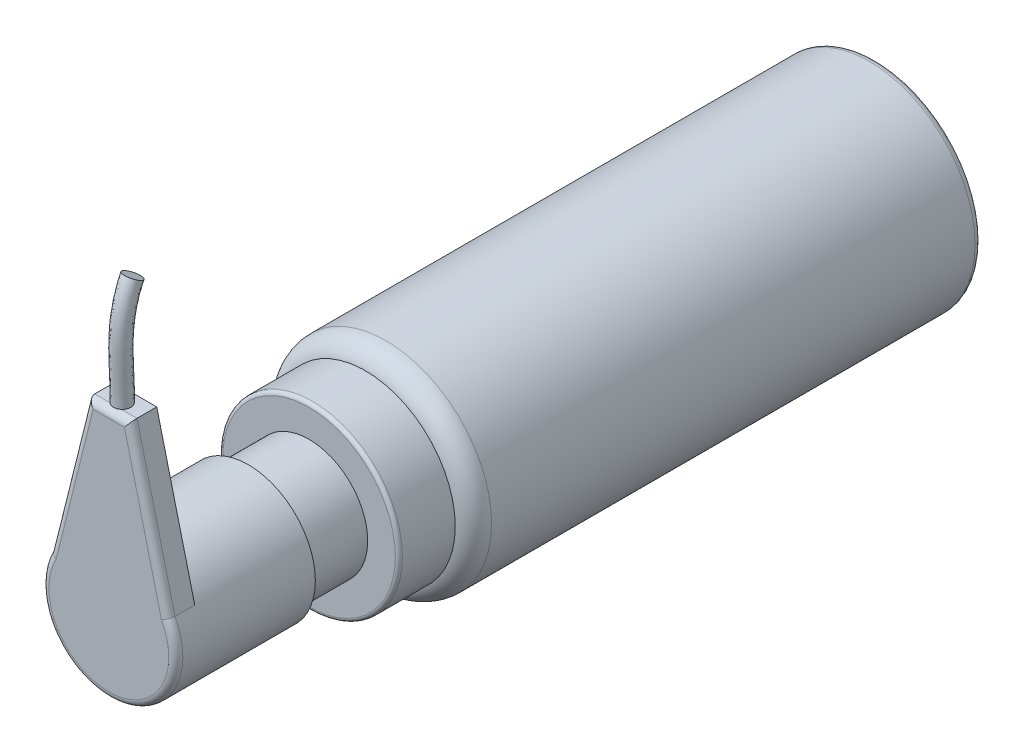
ISO-10303-21;
HEADER;
FILE_DESCRIPTION(('STEP AP214'),'2;1');
FILE_NAME('part.step','',(''),(''),'','','');
FILE_SCHEMA(('AUTOMOTIVE_DESIGN { 1 0 10303 214 1 1 1 1 }'));
ENDSEC;
DATA;
#1=APPLICATION_CONTEXT('core data for automotive mechanical design processes');
#2=APPLICATION_PROTOCOL_DEFINITION('international standard','automotive_design',2000,#1);
#3=PRODUCT_CONTEXT('',#1,'mechanical');
#4=PRODUCT('Part','Part','',(#3));
#5=PRODUCT_RELATED_PRODUCT_CATEGORY('part','',(#4));
#6=PRODUCT_DEFINITION_FORMATION('','',#4);
#7=PRODUCT_DEFINITION_CONTEXT('part definition',#1,'design');
#8=PRODUCT_DEFINITION('design','',#6,#7);
#9=PRODUCT_DEFINITION_SHAPE('','',#8);
#10=(LENGTH_UNIT() NAMED_UNIT(*) SI_UNIT(.MILLI.,.METRE.));
#11=(NAMED_UNIT(*) PLANE_ANGLE_UNIT() SI_UNIT($,.RADIAN.));
#12=(NAMED_UNIT(*) SI_UNIT($,.STERADIAN.) SOLID_ANGLE_UNIT());
#13=UNCERTAINTY_MEASURE_WITH_UNIT(LENGTH_MEASURE(1.E-05),#10,'distance_accuracy_value','');
#14=(GEOMETRIC_REPRESENTATION_CONTEXT(3) GLOBAL_UNCERTAINTY_ASSIGNED_CONTEXT((#13)) GLOBAL_UNIT_ASSIGNED_CONTEXT((#10,
#11,#12)) REPRESENTATION_CONTEXT('',''));
#15=CARTESIAN_POINT('',(0.,0.,0.));
#16=DIRECTION('',(0.,0.,1.));
#17=DIRECTION('',(1.,0.,0.));
#18=AXIS2_PLACEMENT_3D('',#15,#16,#17);
#19=CARTESIAN_POINT('',(-6.,52.2,217.8));
#20=DIRECTION('',(0.,-1.,0.));
#21=DIRECTION('',(0.,0.,-1.));
#22=AXIS2_PLACEMENT_3D('',#19,#20,#21);
#23=PLANE('',#22);
#24=DIRECTION('',(0.,0.,-1.));
#25=VECTOR('',#24,1.);
#26=CARTESIAN_POINT('',(-6.,52.2,217.8));
#27=LINE('',#26,#25);
#28=CARTESIAN_POINT('',(-6.,52.2,215.8));
#29=VERTEX_POINT('',#28);
#30=CARTESIAN_POINT('',(-6.,52.2,210.2));
#31=VERTEX_POINT('',#30);
#32=EDGE_CURVE('E293',#29,#31,#27,.T.);
#33=ORIENTED_EDGE('',*,*,#32,.F.);
#34=DIRECTION('',(-1.,0.,0.));
#35=VECTOR('',#34,1.);
#36=CARTESIAN_POINT('',(6.,52.2,215.8));
#37=LINE('',#36,#35);
#38=CARTESIAN_POINT('',(6.,52.2,215.8));
#39=VERTEX_POINT('',#38);
#40=EDGE_CURVE('E59',#29,#39,#37,.F.);
#41=ORIENTED_EDGE('',*,*,#40,.T.);
#42=DIRECTION('',(0.,0.,-1.));
#43=VECTOR('',#42,1.);
#44=CARTESIAN_POINT('',(6.,52.2,217.8));
#45=LINE('',#44,#43);
#46=CARTESIAN_POINT('',(6.,52.2,210.2));
#47=VERTEX_POINT('',#46);
#48=EDGE_CURVE('E287',#39,#47,#45,.T.);
#49=ORIENTED_EDGE('',*,*,#48,.T.);
#50=DIRECTION('',(-1.,0.,0.));
#51=VECTOR('',#50,1.);
#52=CARTESIAN_POINT('',(-6.,52.2,210.2));
#53=LINE('',#52,#51);
#54=EDGE_CURVE('E306',#47,#31,#53,.T.);
#55=ORIENTED_EDGE('',*,*,#54,.T.);
#56=EDGE_LOOP('',(#33,#41,#49,#55));
#57=FACE_BOUND('',#56,.T.);
#58=DIRECTION('',(1.,0.,0.));
#59=VECTOR('',#58,1.);
#60=CARTESIAN_POINT('',(-6.,52.2,214.));
#61=LINE('',#60,#59);
#62=CARTESIAN_POINT('',(-2.45,52.2,214.));
#63=VERTEX_POINT('',#62);
#64=CARTESIAN_POINT('',(2.45000000000001,52.2,214.));
#65=VERTEX_POINT('',#64);
#66=EDGE_CURVE('E117',#63,#65,#61,.T.);
#67=ORIENTED_EDGE('',*,*,#66,.F.);
#68=CARTESIAN_POINT('',(-2.45000000000001,52.2,214.));
#69=CARTESIAN_POINT('',(-2.45000659803279,52.2,213.931081141444));
#70=CARTESIAN_POINT('',(-2.44709250182653,52.2,213.862165411608));
#71=CARTESIAN_POINT('',(-2.43547397458848,52.2,213.724826961542));
#72=CARTESIAN_POINT('',(-2.4267698196105,52.2,213.656404217966));
#73=CARTESIAN_POINT('',(-2.40363032431114,52.2,213.520579403477));
#74=CARTESIAN_POINT('',(-2.3891990016904,52.2,213.453176651364));
#75=CARTESIAN_POINT('',(-2.35472218661011,52.2,213.319842914408));
#76=CARTESIAN_POINT('',(-2.3346767626122,52.2,213.25391191163));
#77=CARTESIAN_POINT('',(-2.26628181829893,52.2,213.058964709798));
#78=CARTESIAN_POINT('',(-2.20966379916461,52.2,212.93273694312));
#79=CARTESIAN_POINT('',(-2.07607760789274,52.2,212.69167446843));
#80=CARTESIAN_POINT('',(-1.9991134491821,52.2,212.576837519631));
#81=CARTESIAN_POINT('',(-1.82699258252728,52.2,212.361697794431));
#82=CARTESIAN_POINT('',(-1.73183624199365,52.2,212.261394724574));
#83=CARTESIAN_POINT('',(-1.52602074878129,52.2,212.078178897707));
#84=CARTESIAN_POINT('',(-1.41535924193903,52.2,211.995268786268));
#85=CARTESIAN_POINT('',(-1.18169973083553,52.2,211.849215946276));
#86=CARTESIAN_POINT('',(-1.05870329466473,52.2,211.786070709289));
#87=CARTESIAN_POINT('',(-0.803862212648881,52.2,211.681332236312));
#88=CARTESIAN_POINT('',(-0.672018137450905,52.2,211.639737611876));
#89=CARTESIAN_POINT('',(-0.403226364747366,52.2,211.579275826215));
#90=CARTESIAN_POINT('',(-0.266278942271252,52.2,211.560407442049));
#91=CARTESIAN_POINT('',(0.00884750234686666,52.2,211.545933498907));
#92=CARTESIAN_POINT('',(0.147026552405833,52.2,211.55032846858));
#93=CARTESIAN_POINT('',(0.420662176640469,52.2,211.582243503526));
#94=CARTESIAN_POINT('',(0.556118875622768,52.2,211.609762506186));
#95=CARTESIAN_POINT('',(0.820552087655614,52.2,211.687192354259));
#96=CARTESIAN_POINT('',(0.949528621190441,52.2,211.737103128885));
#97=CARTESIAN_POINT('',(1.13522546715122,52.2,211.827592338858));
#98=CARTESIAN_POINT('',(1.19585945212824,52.2,211.86038050628));
#99=CARTESIAN_POINT('',(1.31415326607994,52.2,211.93094568111));
#100=CARTESIAN_POINT('',(1.3718137801297,52.2,211.968721532171));
#101=CARTESIAN_POINT('',(1.48372253826131,52.2,212.048981207657));
#102=CARTESIAN_POINT('',(1.5379721904059,52.2,212.09146306909));
#103=CARTESIAN_POINT('',(1.64274427084679,52.2,212.180872471063));
#104=CARTESIAN_POINT('',(1.69326305280783,52.2,212.227804261035));
#105=CARTESIAN_POINT('',(1.83854927282689,52.2,212.374692362676));
#106=CARTESIAN_POINT('',(1.92718988762623,52.2,212.480844392596));
#107=CARTESIAN_POINT('',(2.08536103737593,52.2,212.706535274406));
#108=CARTESIAN_POINT('',(2.15489228516604,52.2,212.826073626711));
#109=CARTESIAN_POINT('',(2.24341332682333,52.2,213.012810178121));
#110=CARTESIAN_POINT('',(2.27031154489046,52.2,213.076366589284));
#111=CARTESIAN_POINT('',(2.31864148663329,52.2,213.205484393182));
#112=CARTESIAN_POINT('',(2.34007763798206,52.2,213.271044113396));
#113=CARTESIAN_POINT('',(2.3773284132318,52.2,213.403665725711));
#114=CARTESIAN_POINT('',(2.39314853553644,52.2,213.470726079829));
#115=CARTESIAN_POINT('',(2.41908441931587,52.2,213.605928475942));
#116=CARTESIAN_POINT('',(2.42920185092551,52.2,213.674070195222));
#117=CARTESIAN_POINT('',(2.44095576195109,52.2,213.785300084813));
#118=CARTESIAN_POINT('',(2.44434951080133,52.2,213.828210307801));
#119=CARTESIAN_POINT('',(2.44886999060301,52.2,213.914078843977));
#120=CARTESIAN_POINT('',(2.45000046046103,52.2,213.957036960358));
#121=CARTESIAN_POINT('',(2.45,52.2,214.));
#122=B_SPLINE_CURVE_WITH_KNOTS('',3,(#68,#69,#70,#71,#72,#73,#74,#75,#76,#77,#78,#79,#80,#81,
#82,#83,#84,#85,#86,#87,#88,#89,#90,#91,#92,#93,#94,#95,#96,#97,#98,#99,#100,#101,#102,#103,
#104,#105,#106,#107,#108,#109,#110,#111,#112,#113,#114,#115,#116,#117,#118,#119,#120,#121),
.UNSPECIFIED.,.F.,.F.,(4,2,2,2,2,2,2,2,2,2,2,2,2,2,2,2,2,2,2,2,2,2,2,2,2,2,4),(0.,
0.206689345067076,0.413368836470264,0.619903594441218,0.826435833916514,1.23932788413839,
1.65213854903558,2.06494087766065,2.47780595049474,2.89061860380944,3.30340465744669,
3.71616849730998,4.12894171709074,4.54169596984845,4.95444891777755,5.16104174249275,
5.36758675447004,5.5740459335454,5.78070429430771,6.19349835282997,6.60627701073912,
6.81311392218467,7.01978262975414,7.22624843550527,7.43265374259673,7.56173161095872,
7.69059606787838),.UNSPECIFIED.);
#123=EDGE_CURVE('E109',#63,#65,#122,.T.);
#124=ORIENTED_EDGE('',*,*,#123,.T.);
#125=EDGE_LOOP('',(#67,#124));
#126=FACE_BOUND('',#125,.T.);
#127=ADVANCED_FACE('F49',(#57,#126),#23,.F.);
#128=CARTESIAN_POINT('',(0.,0.,145.));
#129=DIRECTION('',(0.,0.,-1.));
#130=DIRECTION('',(-1.,0.,0.));
#131=AXIS2_PLACEMENT_3D('',#128,#129,#130);
#132=CYLINDRICAL_SURFACE('',#131,30.);
#133=CARTESIAN_POINT('',(0.,0.,2.));
#134=DIRECTION('',(0.,0.,1.));
#135=DIRECTION('',(1.,0.,0.));
#136=AXIS2_PLACEMENT_3D('',#133,#134,#135);
#137=CIRCLE('',#136,30.);
#138=CARTESIAN_POINT('',(30.,0.,2.));
#139=VERTEX_POINT('',#138);
#140=EDGE_CURVE('E147',#139,#139,#137,.T.);
#141=ORIENTED_EDGE('',*,*,#140,.T.);
#142=EDGE_LOOP('',(#141));
#143=FACE_BOUND('',#142,.T.);
#144=CARTESIAN_POINT('',(0.,0.,139.190524980689));
#145=DIRECTION('',(0.,0.,1.));
#146=DIRECTION('',(1.,0.,0.));
#147=AXIS2_PLACEMENT_3D('',#144,#145,#146);
#148=CIRCLE('',#147,30.);
#149=CARTESIAN_POINT('',(30.,0.,139.190524980689));
#150=VERTEX_POINT('',#149);
#151=EDGE_CURVE('E126',#150,#150,#148,.F.);
#152=ORIENTED_EDGE('',*,*,#151,.T.);
#153=EDGE_LOOP('',(#152));
#154=FACE_BOUND('',#153,.T.);
#155=ADVANCED_FACE('F211',(#143,#154),#132,.T.);
#156=CARTESIAN_POINT('',(0.,0.,0.));
#157=DIRECTION('',(0.,0.,1.));
#158=DIRECTION('',(1.,0.,0.));
#159=AXIS2_PLACEMENT_3D('',#156,#157,#158);
#160=PLANE('',#159);
#161=CARTESIAN_POINT('',(0.,0.,0.));
#162=DIRECTION('',(0.,0.,1.));
#163=DIRECTION('',(1.,0.,0.));
#164=AXIS2_PLACEMENT_3D('',#161,#162,#163);
#165=CIRCLE('',#164,28.);
#166=CARTESIAN_POINT('',(28.,0.,0.));
#167=VERTEX_POINT('',#166);
#168=EDGE_CURVE('E151',#167,#167,#165,.F.);
#169=ORIENTED_EDGE('',*,*,#168,.T.);
#170=EDGE_LOOP('',(#169));
#171=FACE_BOUND('',#170,.T.);
#172=ADVANCED_FACE('F215',(#171),#160,.F.);
#173=CARTESIAN_POINT('',(0.,0.,161.));
#174=DIRECTION('',(0.,0.,-1.));
#175=DIRECTION('',(-1.,0.,0.));
#176=AXIS2_PLACEMENT_3D('',#173,#174,#175);
#177=CYLINDRICAL_SURFACE('',#176,25.5);
#178=CARTESIAN_POINT('',(0.,0.,160.));
#179=DIRECTION('',(0.,0.,1.));
#180=DIRECTION('',(1.,0.,0.));
#181=AXIS2_PLACEMENT_3D('',#178,#179,#180);
#182=CIRCLE('',#181,25.5);
#183=CARTESIAN_POINT('',(25.5,0.,160.));
#184=VERTEX_POINT('',#183);
#185=EDGE_CURVE('E143',#184,#184,#182,.F.);
#186=ORIENTED_EDGE('',*,*,#185,.T.);
#187=EDGE_LOOP('',(#186));
#188=FACE_BOUND('',#187,.T.);
#189=CARTESIAN_POINT('',(0.,0.,145.));
#190=DIRECTION('',(0.,0.,1.));
#191=DIRECTION('',(1.,0.,0.));
#192=AXIS2_PLACEMENT_3D('',#189,#190,#191);
#193=CIRCLE('',#192,25.5);
#194=CARTESIAN_POINT('',(25.5,0.,145.));
#195=VERTEX_POINT('',#194);
#196=EDGE_CURVE('E271',#195,#195,#193,.T.);
#197=ORIENTED_EDGE('',*,*,#196,.T.);
#198=EDGE_LOOP('',(#197));
#199=FACE_BOUND('',#198,.T.);
#200=ADVANCED_FACE('F243',(#188,#199),#177,.T.);
#201=CARTESIAN_POINT('',(0.,0.,161.));
#202=DIRECTION('',(0.,0.,1.));
#203=DIRECTION('',(1.,0.,0.));
#204=AXIS2_PLACEMENT_3D('',#201,#202,#203);
#205=PLANE('',#204);
#206=CARTESIAN_POINT('',(0.,0.,161.));
#207=DIRECTION('',(0.,0.,1.));
#208=DIRECTION('',(1.,0.,0.));
#209=AXIS2_PLACEMENT_3D('',#206,#207,#208);
#210=CIRCLE('',#209,24.5);
#211=CARTESIAN_POINT('',(24.5,0.,161.));
#212=VERTEX_POINT('',#211);
#213=EDGE_CURVE('E130',#212,#212,#210,.T.);
#214=ORIENTED_EDGE('',*,*,#213,.T.);
#215=EDGE_LOOP('',(#214));
#216=FACE_BOUND('',#215,.T.);
#217=CARTESIAN_POINT('',(0.,0.,161.));
#218=DIRECTION('',(0.,0.,1.));
#219=DIRECTION('',(1.,0.,0.));
#220=AXIS2_PLACEMENT_3D('',#217,#218,#219);
#221=CIRCLE('',#220,16.65);
#222=CARTESIAN_POINT('',(-16.65,0.,161.));
#223=VERTEX_POINT('',#222);
#224=EDGE_CURVE('E118',#223,#223,#221,.T.);
#225=ORIENTED_EDGE('',*,*,#224,.F.);
#226=EDGE_LOOP('',(#225));
#227=FACE_BOUND('',#226,.T.);
#228=ADVANCED_FACE('F239',(#216,#227),#205,.T.);
#229=CARTESIAN_POINT('',(0.,0.,178.2));
#230=DIRECTION('',(0.,0.,-1.));
#231=DIRECTION('',(-1.,0.,0.));
#232=AXIS2_PLACEMENT_3D('',#229,#230,#231);
#233=CYLINDRICAL_SURFACE('',#232,16.65);
#234=CARTESIAN_POINT('',(0.,0.,178.2));
#235=DIRECTION('',(0.,0.,1.));
#236=DIRECTION('',(1.,0.,0.));
#237=AXIS2_PLACEMENT_3D('',#234,#235,#236);
#238=CIRCLE('',#237,16.65);
#239=CARTESIAN_POINT('',(-16.65,0.,178.2));
#240=VERTEX_POINT('',#239);
#241=EDGE_CURVE('E274',#240,#240,#238,.T.);
#242=CARTESIAN_POINT('',(-16.65,0.,178.2));
#243=CARTESIAN_POINT('',(-16.65,0.,178.020833333333));
#244=CARTESIAN_POINT('',(-16.65,0.,177.841666666667));
#245=CARTESIAN_POINT('',(-16.65,0.,177.483333333333));
#246=CARTESIAN_POINT('',(-16.65,0.,177.304166666667));
#247=CARTESIAN_POINT('',(-16.65,0.,176.945833333333));
#248=CARTESIAN_POINT('',(-16.65,0.,176.766666666667));
#249=CARTESIAN_POINT('',(-16.65,0.,176.408333333333));
#250=CARTESIAN_POINT('',(-16.65,0.,176.229166666667));
#251=CARTESIAN_POINT('',(-16.65,0.,175.870833333333));
#252=CARTESIAN_POINT('',(-16.65,0.,175.691666666667));
#253=CARTESIAN_POINT('',(-16.65,0.,175.333333333333));
#254=CARTESIAN_POINT('',(-16.65,0.,175.154166666667));
#255=CARTESIAN_POINT('',(-16.65,0.,174.795833333333));
#256=CARTESIAN_POINT('',(-16.65,0.,174.616666666667));
#257=CARTESIAN_POINT('',(-16.65,0.,174.258333333333));
#258=CARTESIAN_POINT('',(-16.65,0.,174.079166666667));
#259=CARTESIAN_POINT('',(-16.65,0.,173.720833333333));
#260=CARTESIAN_POINT('',(-16.65,0.,173.541666666667));
#261=CARTESIAN_POINT('',(-16.65,0.,173.183333333333));
#262=CARTESIAN_POINT('',(-16.65,0.,173.004166666667));
#263=CARTESIAN_POINT('',(-16.65,0.,172.645833333333));
#264=CARTESIAN_POINT('',(-16.65,0.,172.466666666667));
#265=CARTESIAN_POINT('',(-16.65,0.,172.108333333333));
#266=CARTESIAN_POINT('',(-16.65,0.,171.929166666667));
#267=CARTESIAN_POINT('',(-16.65,0.,171.570833333333));
#268=CARTESIAN_POINT('',(-16.65,0.,171.391666666667));
#269=CARTESIAN_POINT('',(-16.65,0.,171.033333333333));
#270=CARTESIAN_POINT('',(-16.65,0.,170.854166666667));
#271=CARTESIAN_POINT('',(-16.65,0.,170.495833333333));
#272=CARTESIAN_POINT('',(-16.65,0.,170.316666666667));
#273=CARTESIAN_POINT('',(-16.65,0.,169.958333333333));
#274=CARTESIAN_POINT('',(-16.65,0.,169.779166666667));
#275=CARTESIAN_POINT('',(-16.65,0.,169.420833333333));
#276=CARTESIAN_POINT('',(-16.65,0.,169.241666666667));
#277=CARTESIAN_POINT('',(-16.65,0.,168.883333333333));
#278=CARTESIAN_POINT('',(-16.65,0.,168.704166666667));
#279=CARTESIAN_POINT('',(-16.65,0.,168.345833333333));
#280=CARTESIAN_POINT('',(-16.65,0.,168.166666666667));
#281=CARTESIAN_POINT('',(-16.65,0.,167.808333333333));
#282=CARTESIAN_POINT('',(-16.65,0.,167.629166666667));
#283=CARTESIAN_POINT('',(-16.65,0.,167.270833333333));
#284=CARTESIAN_POINT('',(-16.65,0.,167.091666666667));
#285=CARTESIAN_POINT('',(-16.65,0.,166.733333333333));
#286=CARTESIAN_POINT('',(-16.65,0.,166.554166666667));
#287=CARTESIAN_POINT('',(-16.65,0.,166.195833333333));
#288=CARTESIAN_POINT('',(-16.65,0.,166.016666666667));
#289=CARTESIAN_POINT('',(-16.65,0.,165.658333333333));
#290=CARTESIAN_POINT('',(-16.65,0.,165.479166666667));
#291=CARTESIAN_POINT('',(-16.65,0.,165.120833333333));
#292=CARTESIAN_POINT('',(-16.65,0.,164.941666666667));
#293=CARTESIAN_POINT('',(-16.65,0.,164.583333333333));
#294=CARTESIAN_POINT('',(-16.65,0.,164.404166666667));
#295=CARTESIAN_POINT('',(-16.65,0.,164.045833333333));
#296=CARTESIAN_POINT('',(-16.65,0.,163.866666666667));
#297=CARTESIAN_POINT('',(-16.65,0.,163.508333333333));
#298=CARTESIAN_POINT('',(-16.65,0.,163.329166666667));
#299=CARTESIAN_POINT('',(-16.65,0.,162.970833333333));
#300=CARTESIAN_POINT('',(-16.65,0.,162.791666666667));
#301=CARTESIAN_POINT('',(-16.65,0.,162.433333333333));
#302=CARTESIAN_POINT('',(-16.65,0.,162.254166666667));
#303=CARTESIAN_POINT('',(-16.65,0.,161.895833333333));
#304=CARTESIAN_POINT('',(-16.65,0.,161.716666666667));
#305=CARTESIAN_POINT('',(-16.65,0.,161.358333333333));
#306=CARTESIAN_POINT('',(-16.65,0.,161.179166666667));
#307=CARTESIAN_POINT('',(-16.65,0.,161.));
#308=B_SPLINE_CURVE_WITH_KNOTS('',3,(#242,#243,#244,#245,#246,#247,#248,#249,#250,#251,#252,
#253,#254,#255,#256,#257,#258,#259,#260,#261,#262,#263,#264,#265,#266,#267,#268,#269,#270,#271,
#272,#273,#274,#275,#276,#277,#278,#279,#280,#281,#282,#283,#284,#285,#286,#287,#288,#289,#290,
#291,#292,#293,#294,#295,#296,#297,#298,#299,#300,#301,#302,#303,#304,#305,#306,#307),
.UNSPECIFIED.,.F.,.F.,(4,2,2,2,2,2,2,2,2,2,2,2,2,2,2,2,2,2,2,2,2,2,2,2,2,2,2,2,2,2,2,2,4),(0.,
0.537500000000024,1.07500000000002,1.61250000000002,2.15000000000001,2.68750000000001,
3.22500000000001,3.7625,4.30000000000003,4.83750000000002,5.37500000000002,5.91250000000001,
6.45000000000001,6.98750000000001,7.525,8.0625,8.60000000000002,9.13750000000002,
9.67500000000002,10.2125,10.75,11.2875,11.825,12.3625,12.9,13.4375,13.975,14.5125,15.05,15.5875,
16.125,16.6625,17.2),.UNSPECIFIED.);
#309=EDGE_CURVE('BSEAM235',#240,#223,#308,.T.);
#310=ORIENTED_EDGE('',*,*,#241,.F.);
#311=ORIENTED_EDGE('',*,*,#224,.T.);
#312=ORIENTED_EDGE('',*,*,#309,.T.);
#313=ORIENTED_EDGE('',*,*,#309,.F.);
#314=EDGE_LOOP('',(#310,#312,#311,#313));
#315=FACE_BOUND('',#314,.T.);
#316=ADVANCED_FACE('F235',(#315),#233,.T.);
#317=CARTESIAN_POINT('',(0.,0.,210.2));
#318=DIRECTION('',(0.,0.,-1.));
#319=DIRECTION('',(-1.,0.,0.));
#320=AXIS2_PLACEMENT_3D('',#317,#318,#319);
#321=CYLINDRICAL_SURFACE('',#320,19.);
#322=DIRECTION('',(0.,0.,-1.));
#323=VECTOR('',#322,1.);
#324=CARTESIAN_POINT('',(16.7808033616233,8.910928040251,217.8));
#325=LINE('',#324,#323);
#326=CARTESIAN_POINT('',(16.7808033616233,8.910928040251,215.8));
#327=VERTEX_POINT('',#326);
#328=CARTESIAN_POINT('',(16.7808033616233,8.910928040251,210.2));
#329=VERTEX_POINT('',#328);
#330=EDGE_CURVE('E299',#327,#329,#325,.T.);
#331=ORIENTED_EDGE('',*,*,#330,.F.);
#332=CARTESIAN_POINT('',(0.,0.,215.8));
#333=DIRECTION('',(0.,0.,1.));
#334=DIRECTION('',(1.,0.,0.));
#335=AXIS2_PLACEMENT_3D('',#332,#333,#334);
#336=CIRCLE('',#335,19.);
#337=CARTESIAN_POINT('',(-16.7808033616233,8.91092804025101,215.8));
#338=VERTEX_POINT('',#337);
#339=EDGE_CURVE('E168',#327,#338,#336,.F.);
#340=ORIENTED_EDGE('',*,*,#339,.T.);
#341=DIRECTION('',(0.,0.,-1.));
#342=VECTOR('',#341,1.);
#343=CARTESIAN_POINT('',(-16.7808033616233,8.91092804025101,217.8));
#344=LINE('',#343,#342);
#345=CARTESIAN_POINT('',(-16.7808033616233,8.91092804025101,210.2));
#346=VERTEX_POINT('',#345);
#347=EDGE_CURVE('E296',#338,#346,#344,.T.);
#348=ORIENTED_EDGE('',*,*,#347,.T.);
#349=CARTESIAN_POINT('',(0.,0.,210.2));
#350=DIRECTION('',(0.,0.,1.));
#351=DIRECTION('',(1.,0.,0.));
#352=AXIS2_PLACEMENT_3D('',#349,#350,#351);
#353=CIRCLE('',#352,19.);
#354=EDGE_CURVE('E280',#329,#346,#353,.T.);
#355=ORIENTED_EDGE('',*,*,#354,.F.);
#356=EDGE_LOOP('',(#331,#340,#348,#355));
#357=FACE_BOUND('',#356,.T.);
#358=CARTESIAN_POINT('',(0.,0.,178.2));
#359=DIRECTION('',(0.,0.,1.));
#360=DIRECTION('',(1.,0.,0.));
#361=AXIS2_PLACEMENT_3D('',#358,#359,#360);
#362=CIRCLE('',#361,19.);
#363=CARTESIAN_POINT('',(19.,0.,178.2));
#364=VERTEX_POINT('',#363);
#365=EDGE_CURVE('E283',#364,#364,#362,.T.);
#366=ORIENTED_EDGE('',*,*,#365,.T.);
#367=EDGE_LOOP('',(#366));
#368=FACE_BOUND('',#367,.T.);
#369=ADVANCED_FACE('F231',(#357,#368),#321,.T.);
#370=CARTESIAN_POINT('',(0.,0.,178.2));
#371=DIRECTION('',(0.,0.,1.));
#372=DIRECTION('',(1.,0.,0.));
#373=AXIS2_PLACEMENT_3D('',#370,#371,#372);
#374=PLANE('',#373);
#375=ORIENTED_EDGE('',*,*,#241,.T.);
#376=EDGE_LOOP('',(#375));
#377=FACE_BOUND('',#376,.T.);
#378=ORIENTED_EDGE('',*,*,#365,.F.);
#379=EDGE_LOOP('',(#378));
#380=FACE_BOUND('',#379,.T.);
#381=ADVANCED_FACE('F228',(#377,#380),#374,.F.);
#382=CARTESIAN_POINT('',(0.,0.,210.2));
#383=DIRECTION('',(0.,0.,1.));
#384=DIRECTION('',(1.,0.,0.));
#385=AXIS2_PLACEMENT_3D('',#382,#383,#384);
#386=PLANE('',#385);
#387=DIRECTION('',(-0.241660736438977,0.970360803239584,0.));
#388=VECTOR('',#387,1.);
#389=CARTESIAN_POINT('',(16.7808033616233,8.91092804025101,210.2));
#390=LINE('',#389,#388);
#391=EDGE_CURVE('E310',#329,#47,#390,.T.);
#392=ORIENTED_EDGE('',*,*,#391,.F.);
#393=ORIENTED_EDGE('',*,*,#354,.T.);
#394=DIRECTION('',(-0.241660736438977,-0.970360803239584,0.));
#395=VECTOR('',#394,1.);
#396=CARTESIAN_POINT('',(-16.7808033616233,8.91092804025101,210.2));
#397=LINE('',#396,#395);
#398=EDGE_CURVE('E302',#31,#346,#397,.T.);
#399=ORIENTED_EDGE('',*,*,#398,.F.);
#400=ORIENTED_EDGE('',*,*,#54,.F.);
#401=EDGE_LOOP('',(#392,#393,#399,#400));
#402=FACE_BOUND('',#401,.T.);
#403=ADVANCED_FACE('F226',(#402),#386,.F.);
#404=CARTESIAN_POINT('',(16.7808033616233,8.91092804025101,217.8));
#405=DIRECTION('',(-0.970360803239584,-0.241660736438977,0.));
#406=DIRECTION('',(0.241660736438977,-0.970360803239584,0.));
#407=AXIS2_PLACEMENT_3D('',#404,#405,#406);
#408=PLANE('',#407);
#409=ORIENTED_EDGE('',*,*,#48,.F.);
#410=DIRECTION('',(-0.241660736438977,0.970360803239584,0.));
#411=VECTOR('',#410,1.);
#412=CARTESIAN_POINT('',(16.7808033616233,8.910928040251,215.8));
#413=LINE('',#412,#411);
#414=EDGE_CURVE('E12',#39,#327,#413,.F.);
#415=ORIENTED_EDGE('',*,*,#414,.T.);
#416=ORIENTED_EDGE('',*,*,#330,.T.);
#417=ORIENTED_EDGE('',*,*,#391,.T.);
#418=EDGE_LOOP('',(#409,#415,#416,#417));
#419=FACE_BOUND('',#418,.T.);
#420=ADVANCED_FACE('F223',(#419),#408,.F.);
#421=CARTESIAN_POINT('',(-16.7808033616233,8.91092804025101,217.8));
#422=DIRECTION('',(0.970360803239584,-0.241660736438977,0.));
#423=DIRECTION('',(0.241660736438977,0.970360803239584,0.));
#424=AXIS2_PLACEMENT_3D('',#421,#422,#423);
#425=PLANE('',#424);
#426=ORIENTED_EDGE('',*,*,#347,.F.);
#427=DIRECTION('',(-0.241660736438977,-0.970360803239584,0.));
#428=VECTOR('',#427,1.);
#429=CARTESIAN_POINT('',(-6.,52.2,215.8));
#430=LINE('',#429,#428);
#431=EDGE_CURVE('E74',#338,#29,#430,.F.);
#432=ORIENTED_EDGE('',*,*,#431,.T.);
#433=ORIENTED_EDGE('',*,*,#32,.T.);
#434=ORIENTED_EDGE('',*,*,#398,.T.);
#435=EDGE_LOOP('',(#426,#432,#433,#434));
#436=FACE_BOUND('',#435,.T.);
#437=ADVANCED_FACE('F221',(#436),#425,.F.);
#438=CARTESIAN_POINT('',(0.,0.,217.8));
#439=DIRECTION('',(0.,0.,1.));
#440=DIRECTION('',(1.,0.,0.));
#441=AXIS2_PLACEMENT_3D('',#438,#439,#440);
#442=PLANE('',#441);
#443=DIRECTION('',(-0.241660736438977,-0.970360803239584,0.));
#444=VECTOR('',#443,1.);
#445=CARTESIAN_POINT('',(-14.8400817551441,8.42760656737305,217.8));
#446=LINE('',#445,#444);
#447=CARTESIAN_POINT('',(-4.43699526809146,50.2,217.8));
#448=VERTEX_POINT('',#447);
#449=CARTESIAN_POINT('',(-14.9010342722068,8.18285876809063,217.8));
#450=VERTEX_POINT('',#449);
#451=EDGE_CURVE('E161',#448,#450,#446,.T.);
#452=ORIENTED_EDGE('',*,*,#451,.T.);
#453=CARTESIAN_POINT('',(0.,0.,217.8));
#454=DIRECTION('',(0.,0.,1.));
#455=DIRECTION('',(1.,0.,0.));
#456=AXIS2_PLACEMENT_3D('',#453,#454,#455);
#457=CIRCLE('',#456,17.);
#458=CARTESIAN_POINT('',(14.9010342722068,8.18285876809063,217.8));
#459=VERTEX_POINT('',#458);
#460=EDGE_CURVE('E164',#450,#459,#457,.T.);
#461=ORIENTED_EDGE('',*,*,#460,.T.);
#462=DIRECTION('',(-0.241660736438977,0.970360803239584,0.));
#463=VECTOR('',#462,1.);
#464=CARTESIAN_POINT('',(4.05927839352084,51.7166785271221,217.8));
#465=LINE('',#464,#463);
#466=CARTESIAN_POINT('',(4.43699526809146,50.2,217.8));
#467=VERTEX_POINT('',#466);
#468=EDGE_CURVE('E155',#459,#467,#465,.T.);
#469=ORIENTED_EDGE('',*,*,#468,.T.);
#470=DIRECTION('',(-1.,0.,0.));
#471=VECTOR('',#470,1.);
#472=CARTESIAN_POINT('',(-6.,50.2,217.8));
#473=LINE('',#472,#471);
#474=EDGE_CURVE('E158',#467,#448,#473,.T.);
#475=ORIENTED_EDGE('',*,*,#474,.T.);
#476=EDGE_LOOP('',(#452,#461,#469,#475));
#477=FACE_BOUND('',#476,.T.);
#478=ADVANCED_FACE('F325',(#477),#442,.T.);
#479=CARTESIAN_POINT('',(0.,52.2,214.));
#480=DIRECTION('',(0.,0.99990972849107,-0.0134363264665425));
#481=DIRECTION('',(0.,0.0134363264665425,0.99990972849107));
#482=AXIS2_PLACEMENT_3D('',#479,#480,#481);
#483=PLANE('',#482);
#484=CARTESIAN_POINT('',(0.,52.2,214.));
#485=DIRECTION('',(0.,0.99990972849107,-0.0134363264665425));
#486=DIRECTION('',(0.,0.0134363264665425,0.99990972849107));
#487=AXIS2_PLACEMENT_3D('',#484,#485,#486);
#488=CIRCLE('',#487,2.45);
#489=EDGE_CURVE('E112',#63,#65,#488,.T.);
#490=ORIENTED_EDGE('',*,*,#489,.F.);
#491=ORIENTED_EDGE('',*,*,#66,.T.);
#492=EDGE_LOOP('',(#490,#491));
#493=FACE_BOUND('',#492,.T.);
#494=ADVANCED_FACE('F121',(#493),#483,.F.);
#495=CARTESIAN_POINT('',(0.,52.232918999843,216.449778834803));
#496=CARTESIAN_POINT('',(0.,56.9996397646329,216.385725839638));
#497=CARTESIAN_POINT('',(0.,61.8791752625194,216.899808057121));
#498=CARTESIAN_POINT('',(0.,72.1128684485851,216.709547267675));
#499=CARTESIAN_POINT('',(0.,77.4955146624844,215.964715770664));
#500=CARTESIAN_POINT('',(0.,83.0087267555122,213.28686989896));
#501=CARTESIAN_POINT('',(4.9,52.232918999843,216.449778834803));
#502=CARTESIAN_POINT('',(4.9,56.9996397646329,216.385725839638));
#503=CARTESIAN_POINT('',(4.9,61.8791752625195,216.899808057121));
#504=CARTESIAN_POINT('',(4.9,72.1128684485851,216.709547267675));
#505=CARTESIAN_POINT('',(4.9,77.4955146624844,215.964715770664));
#506=CARTESIAN_POINT('',(4.9,83.0087267555122,213.286869898961));
#507=CARTESIAN_POINT('',(4.9,52.167081000157,211.550221165197));
#508=CARTESIAN_POINT('',(4.9,57.3150047426545,211.481045740845));
#509=CARTESIAN_POINT('',(4.9,62.1890687063467,211.993199876158));
#510=CARTESIAN_POINT('',(4.9,71.6208087519059,211.817848683878));
#511=CARTESIAN_POINT('',(4.9,76.1499963074072,211.17083184916));
#512=CARTESIAN_POINT('',(4.9,80.8678973381013,208.879279921938));
#513=CARTESIAN_POINT('',(0.,52.167081000157,211.550221165197));
#514=CARTESIAN_POINT('',(0.,57.3150047426545,211.481045740845));
#515=CARTESIAN_POINT('',(0.,62.1890687063467,211.993199876158));
#516=CARTESIAN_POINT('',(0.,71.6208087519059,211.817848683878));
#517=CARTESIAN_POINT('',(0.,76.1499963074072,211.17083184916));
#518=CARTESIAN_POINT('',(0.,80.8678973381013,208.879279921938));
#519=CARTESIAN_POINT('',(-4.9,52.167081000157,211.550221165197));
#520=CARTESIAN_POINT('',(-4.9,57.3150047426545,211.481045740845));
#521=CARTESIAN_POINT('',(-4.9,62.1890687063467,211.993199876158));
#522=CARTESIAN_POINT('',(-4.9,71.6208087519059,211.817848683878));
#523=CARTESIAN_POINT('',(-4.9,76.1499963074072,211.17083184916));
#524=CARTESIAN_POINT('',(-4.9,80.8678973381013,208.879279921938));
#525=CARTESIAN_POINT('',(-4.9,52.232918999843,216.449778834803));
#526=CARTESIAN_POINT('',(-4.9,56.9996397646329,216.385725839638));
#527=CARTESIAN_POINT('',(-4.9,61.8791752625195,216.899808057121));
#528=CARTESIAN_POINT('',(-4.9,72.1128684485851,216.709547267675));
#529=CARTESIAN_POINT('',(-4.9,77.4955146624844,215.964715770664));
#530=CARTESIAN_POINT('',(-4.9,83.0087267555122,213.286869898961));
#531=CARTESIAN_POINT('',(0.,52.232918999843,216.449778834803));
#532=CARTESIAN_POINT('',(0.,56.9996397646329,216.385725839638));
#533=CARTESIAN_POINT('',(0.,61.8791752625194,216.899808057121));
#534=CARTESIAN_POINT('',(0.,72.1128684485851,216.709547267675));
#535=CARTESIAN_POINT('',(0.,77.4955146624844,215.964715770664));
#536=CARTESIAN_POINT('',(0.,83.0087267555122,213.28686989896));
#537=(BOUNDED_SURFACE() B_SPLINE_SURFACE(3,3,((#495,#496,#497,#498,#499,#500),(#501,#502,#503,
#504,#505,#506),(#507,#508,#509,#510,#511,#512),(#513,#514,#515,#516,#517,#518),(#519,#520,#521,
#522,#523,#524),(#525,#526,#527,#528,#529,#530),(#531,#532,#533,#534,#535,#536)),.UNSPECIFIED.,
.T.,.F.,.F.) B_SPLINE_SURFACE_WITH_KNOTS((4,3,4),(4,2,4),(0.,0.5,1.),(0.,0.5,1.),
.UNSPECIFIED.) GEOMETRIC_REPRESENTATION_ITEM() RATIONAL_B_SPLINE_SURFACE(((1.,1.,1.,1.,1.,1.),
(0.333333333333333,0.333333333333333,0.333333333333333,0.333333333333333,0.333333333333333,
0.333333333333333),(0.333333333333333,0.333333333333333,0.333333333333333,0.333333333333333,
0.333333333333333,0.333333333333333),(1.,1.,1.,1.,1.,1.),(0.333333333333333,0.333333333333333,
0.333333333333333,0.333333333333333,0.333333333333333,0.333333333333333),(0.333333333333333,
0.333333333333333,0.333333333333333,0.333333333333333,0.333333333333333,0.333333333333333),(1.,
1.,1.,1.,1.,1.))) REPRESENTATION_ITEM('') SURFACE());
#538=CARTESIAN_POINT('',(0.,81.9383120468068,211.083074910449));
#539=DIRECTION('',(0.,0.899508158575998,-0.436903962736913));
#540=DIRECTION('',(0.,0.436903962736913,0.899508158575998));
#541=AXIS2_PLACEMENT_3D('',#538,#539,#540);
#542=CIRCLE('',#541,2.45);
#543=CARTESIAN_POINT('',(0.,83.0087267555122,213.28686989896));
#544=VERTEX_POINT('',#543);
#545=EDGE_CURVE('E123',#544,#544,#542,.T.);
#546=ORIENTED_EDGE('',*,*,#545,.F.);
#547=EDGE_LOOP('',(#546));
#548=FACE_BOUND('',#547,.T.);
#549=ORIENTED_EDGE('',*,*,#123,.F.);
#550=ORIENTED_EDGE('',*,*,#489,.T.);
#551=EDGE_LOOP('',(#549,#550));
#552=FACE_BOUND('',#551,.T.);
#553=ADVANCED_FACE('F111',(#548,#552),#537,.T.);
#554=CARTESIAN_POINT('',(0.,81.9383120468068,211.083074910449));
#555=DIRECTION('',(0.,0.899508158575998,-0.436903962736913));
#556=DIRECTION('',(0.,0.436903962736913,0.899508158575998));
#557=AXIS2_PLACEMENT_3D('',#554,#555,#556);
#558=PLANE('',#557);
#559=ORIENTED_EDGE('',*,*,#545,.T.);
#560=EDGE_LOOP('',(#559));
#561=FACE_BOUND('',#560,.T.);
#562=ADVANCED_FACE('F255',(#561),#558,.T.);
#563=CARTESIAN_POINT('',(0.,0.,139.190524980689));
#564=DIRECTION('',(0.,0.,1.));
#565=DIRECTION('',(1.,0.,0.));
#566=AXIS2_PLACEMENT_3D('',#563,#564,#565);
#567=TOROIDAL_SURFACE('',#566,24.,6.);
#568=ORIENTED_EDGE('',*,*,#151,.F.);
#569=EDGE_LOOP('',(#568));
#570=FACE_BOUND('',#569,.T.);
#571=ORIENTED_EDGE('',*,*,#196,.F.);
#572=EDGE_LOOP('',(#571));
#573=FACE_BOUND('',#572,.T.);
#574=ADVANCED_FACE('F251',(#570,#573),#567,.T.);
#575=CARTESIAN_POINT('',(0.,0.,160.));
#576=DIRECTION('',(0.,0.,1.));
#577=DIRECTION('',(1.,0.,0.));
#578=AXIS2_PLACEMENT_3D('',#575,#576,#577);
#579=TOROIDAL_SURFACE('',#578,24.5,1.);
#580=ORIENTED_EDGE('',*,*,#185,.F.);
#581=EDGE_LOOP('',(#580));
#582=FACE_BOUND('',#581,.T.);
#583=ORIENTED_EDGE('',*,*,#213,.F.);
#584=EDGE_LOOP('',(#583));
#585=FACE_BOUND('',#584,.T.);
#586=ADVANCED_FACE('F254',(#582,#585),#579,.T.);
#587=CARTESIAN_POINT('',(0.,0.,2.));
#588=DIRECTION('',(0.,0.,1.));
#589=DIRECTION('',(1.,0.,0.));
#590=AXIS2_PLACEMENT_3D('',#587,#588,#589);
#591=TOROIDAL_SURFACE('',#590,28.,2.);
#592=ORIENTED_EDGE('',*,*,#168,.F.);
#593=EDGE_LOOP('',(#592));
#594=FACE_BOUND('',#593,.T.);
#595=ORIENTED_EDGE('',*,*,#140,.F.);
#596=EDGE_LOOP('',(#595));
#597=FACE_BOUND('',#596,.T.);
#598=ADVANCED_FACE('F207',(#594,#597),#591,.T.);
#599=CARTESIAN_POINT('',(0.,50.2,215.8));
#600=DIRECTION('',(1.,0.,0.));
#601=DIRECTION('',(0.,0.,-1.));
#602=AXIS2_PLACEMENT_3D('',#599,#600,#601);
#603=CYLINDRICAL_SURFACE('',#602,2.);
#604=CARTESIAN_POINT('',(4.43699526809146,50.2,215.8));
#605=DIRECTION('',(0.787927895317515,-0.615767514392008,0.));
#606=DIRECTION('',(-0.615767514392008,-0.787927895317515,0.));
#607=AXIS2_PLACEMENT_3D('',#604,#605,#606);
#608=ELLIPSE('',#607,2.5383033293853,2.);
#609=EDGE_CURVE('E355',#39,#467,#608,.T.);
#610=ORIENTED_EDGE('',*,*,#609,.F.);
#611=ORIENTED_EDGE('',*,*,#40,.F.);
#612=CARTESIAN_POINT('',(-4.43699526809146,50.2,215.8));
#613=DIRECTION('',(0.787927895317515,0.615767514392008,0.));
#614=DIRECTION('',(0.615767514392008,-0.787927895317515,0.));
#615=AXIS2_PLACEMENT_3D('',#612,#613,#614);
#616=ELLIPSE('',#615,2.5383033293853,2.);
#617=EDGE_CURVE('E53',#448,#29,#616,.F.);
#618=ORIENTED_EDGE('',*,*,#617,.F.);
#619=ORIENTED_EDGE('',*,*,#474,.F.);
#620=EDGE_LOOP('',(#610,#611,#618,#619));
#621=FACE_BOUND('',#620,.T.);
#622=ADVANCED_FACE('F51',(#621),#603,.T.);
#623=CARTESIAN_POINT('',(-15.9496800743325,3.97214254724756,215.8));
#624=DIRECTION('',(0.241660736438977,0.970360803239584,0.));
#625=DIRECTION('',(-0.970360803239584,0.241660736438977,0.));
#626=AXIS2_PLACEMENT_3D('',#623,#624,#625);
#627=CYLINDRICAL_SURFACE('',#626,2.);
#628=ORIENTED_EDGE('',*,*,#617,.T.);
#629=ORIENTED_EDGE('',*,*,#431,.F.);
#630=CARTESIAN_POINT('',(-16.7808033616233,8.91092804025101,215.8));
#631=CARTESIAN_POINT('',(-16.7808032389423,8.9109278996961,215.855958863265));
#632=CARTESIAN_POINT('',(-16.7785926269002,8.9100804528589,215.911890815493));
#633=CARTESIAN_POINT('',(-16.7697751269648,8.90669962239784,216.023352272937));
#634=CARTESIAN_POINT('',(-16.7631685116474,8.90416634330472,216.07888180289));
#635=CARTESIAN_POINT('',(-16.736822714729,8.89406266003692,216.24415722882));
#636=CARTESIAN_POINT('',(-16.7105573782813,8.88398833704697,216.352792366175));
#637=CARTESIAN_POINT('',(-16.6413886776563,8.85744027492484,216.563788272148));
#638=CARTESIAN_POINT('',(-16.5984785593584,8.84096393797839,216.66614647416));
#639=CARTESIAN_POINT('',(-16.4972913959909,8.80207494370803,216.861722096538));
#640=CARTESIAN_POINT('',(-16.4390170246722,8.7796633192644,216.954941103476));
#641=CARTESIAN_POINT('',(-16.3085942886164,8.72944642859208,217.129929582894));
#642=CARTESIAN_POINT('',(-16.2364031286935,8.70162452296911,217.211662358074));
#643=CARTESIAN_POINT('',(-16.0803250256087,8.64139089206357,217.361115721427));
#644=CARTESIAN_POINT('',(-15.9964343133514,8.60897768760792,217.428831776479));
#645=CARTESIAN_POINT('',(-15.8187296386904,8.54021064378131,217.548825318998));
#646=CARTESIAN_POINT('',(-15.7248476652747,8.50382974840387,217.600986417347));
#647=CARTESIAN_POINT('',(-15.5303614697264,8.42833339275143,217.687769462706));
#648=CARTESIAN_POINT('',(-15.4297618444057,8.38921980159764,217.722403267008));
#649=CARTESIAN_POINT('',(-15.2600545565729,8.32311656319646,217.764505960558));
#650=CARTESIAN_POINT('',(-15.1920161753988,8.29658402521982,217.777220974064));
#651=CARTESIAN_POINT('',(-15.055146299196,8.24314453448246,217.794600810044));
#652=CARTESIAN_POINT('',(-14.9863163206714,8.2162382820128,217.799279058545));
#653=CARTESIAN_POINT('',(-14.9120243088165,8.18716084124929,217.799974375905));
#654=CARTESIAN_POINT('',(-14.9065290600715,8.18500982137206,217.800000066826));
#655=CARTESIAN_POINT('',(-14.9010342722068,8.18285876809063,217.8));
#656=B_SPLINE_CURVE_WITH_KNOTS('',3,(#630,#631,#632,#633,#634,#635,#636,#637,#638,#639,#640,
#641,#642,#643,#644,#645,#646,#647,#648,#649,#650,#651,#652,#653,#654,#655),.UNSPECIFIED.,.F.,
.F.,(4,2,2,2,2,2,2,2,2,2,2,2,4),(0.,0.167773127754667,0.335535853635248,0.670461843802327,
1.00552388267211,1.34052765110176,1.6765785057216,2.01273787271675,2.35135281941674,
2.68973838435902,2.91173762457137,3.13336563622364,3.15106926133226),.UNSPECIFIED.);
#657=EDGE_CURVE('E185',#450,#338,#656,.F.);
#658=ORIENTED_EDGE('',*,*,#657,.F.);
#659=ORIENTED_EDGE('',*,*,#451,.F.);
#660=EDGE_LOOP('',(#628,#629,#658,#659));
#661=FACE_BOUND('',#660,.T.);
#662=ADVANCED_FACE('F197',(#661),#627,.T.);
#663=CARTESIAN_POINT('',(15.9496800743325,3.97214254724756,215.8));
#664=DIRECTION('',(0.241660736438977,-0.970360803239584,0.));
#665=DIRECTION('',(0.970360803239584,0.241660736438977,0.));
#666=AXIS2_PLACEMENT_3D('',#663,#664,#665);
#667=CYLINDRICAL_SURFACE('',#666,2.);
#668=ORIENTED_EDGE('',*,*,#609,.T.);
#669=ORIENTED_EDGE('',*,*,#468,.F.);
#670=CARTESIAN_POINT('',(16.7808033616233,8.910928040251,215.8));
#671=CARTESIAN_POINT('',(16.7808032389423,8.9109278996961,215.855958863265));
#672=CARTESIAN_POINT('',(16.7785926269002,8.9100804528589,215.911890815493));
#673=CARTESIAN_POINT('',(16.7697751269648,8.90669962239784,216.023352272937));
#674=CARTESIAN_POINT('',(16.7631685116474,8.90416634330471,216.07888180289));
#675=CARTESIAN_POINT('',(16.736822714729,8.89406266003691,216.24415722882));
#676=CARTESIAN_POINT('',(16.7105573782813,8.88398833704698,216.352792366175));
#677=CARTESIAN_POINT('',(16.6413886776563,8.85744027492485,216.563788272148));
#678=CARTESIAN_POINT('',(16.5984785593584,8.84096393797838,216.66614647416));
#679=CARTESIAN_POINT('',(16.4972913959909,8.80207494370802,216.861722096538));
#680=CARTESIAN_POINT('',(16.4390170246722,8.77966331926439,216.954941103476));
#681=CARTESIAN_POINT('',(16.3085942886163,8.72944642859208,217.129929582894));
#682=CARTESIAN_POINT('',(16.2364031286935,8.70162452296911,217.211662358074));
#683=CARTESIAN_POINT('',(16.0803250256087,8.64139089206357,217.361115721427));
#684=CARTESIAN_POINT('',(15.9964343133514,8.60897768760792,217.428831776479));
#685=CARTESIAN_POINT('',(15.8187296386904,8.54021064378131,217.548825318998));
#686=CARTESIAN_POINT('',(15.7248476652747,8.50382974840387,217.600986417347));
#687=CARTESIAN_POINT('',(15.5303614697264,8.42833339275142,217.687769462706));
#688=CARTESIAN_POINT('',(15.4297618444057,8.38921980159763,217.722403267008));
#689=CARTESIAN_POINT('',(15.2600545565729,8.32311656319647,217.764505960558));
#690=CARTESIAN_POINT('',(15.1920161753988,8.29658402521984,217.777220974064));
#691=CARTESIAN_POINT('',(15.055146299196,8.24314453448245,217.794600810044));
#692=CARTESIAN_POINT('',(14.9863163206714,8.21623828201276,217.799279058545));
#693=CARTESIAN_POINT('',(14.9120243088165,8.1871608412493,217.799974375905));
#694=CARTESIAN_POINT('',(14.9065290600715,8.18500982137207,217.800000066826));
#695=CARTESIAN_POINT('',(14.9010342722068,8.18285876809064,217.8));
#696=B_SPLINE_CURVE_WITH_KNOTS('',3,(#670,#671,#672,#673,#674,#675,#676,#677,#678,#679,#680,
#681,#682,#683,#684,#685,#686,#687,#688,#689,#690,#691,#692,#693,#694,#695),.UNSPECIFIED.,.F.,
.F.,(4,2,2,2,2,2,2,2,2,2,2,2,4),(0.,0.167773127754667,0.335535853635248,0.670461843802327,
1.0055238826721,1.34052765110177,1.6765785057216,2.01273787271675,2.35135281941674,
2.68973838435902,2.91173762457137,3.13336563622364,3.15106926133226),.UNSPECIFIED.);
#697=EDGE_CURVE('E176',#327,#459,#696,.T.);
#698=ORIENTED_EDGE('',*,*,#697,.F.);
#699=ORIENTED_EDGE('',*,*,#414,.F.);
#700=EDGE_LOOP('',(#668,#669,#698,#699));
#701=FACE_BOUND('',#700,.T.);
#702=ADVANCED_FACE('F190',(#701),#667,.T.);
#703=CARTESIAN_POINT('',(0.,0.,215.8));
#704=DIRECTION('',(0.,0.,1.));
#705=DIRECTION('',(1.,0.,0.));
#706=AXIS2_PLACEMENT_3D('',#703,#704,#705);
#707=TOROIDAL_SURFACE('',#706,17.,2.);
#708=ORIENTED_EDGE('',*,*,#657,.T.);
#709=ORIENTED_EDGE('',*,*,#339,.F.);
#710=ORIENTED_EDGE('',*,*,#697,.T.);
#711=ORIENTED_EDGE('',*,*,#460,.F.);
#712=EDGE_LOOP('',(#708,#709,#710,#711));
#713=FACE_BOUND('',#712,.T.);
#714=ADVANCED_FACE('F193',(#713),#707,.T.);
#715=CLOSED_SHELL('',(#127,#155,#172,#200,#228,#316,#369,#381,#403,#420,#437,#478,#494,#553,
#562,#574,#586,#598,#622,#662,#702,#714));
#716=MANIFOLD_SOLID_BREP('B2',#715);
#717=ADVANCED_BREP_SHAPE_REPRESENTATION('',(#18,#716),#14);
#718=SHAPE_DEFINITION_REPRESENTATION(#9,#717);
ENDSEC;
END-ISO-10303-21;
